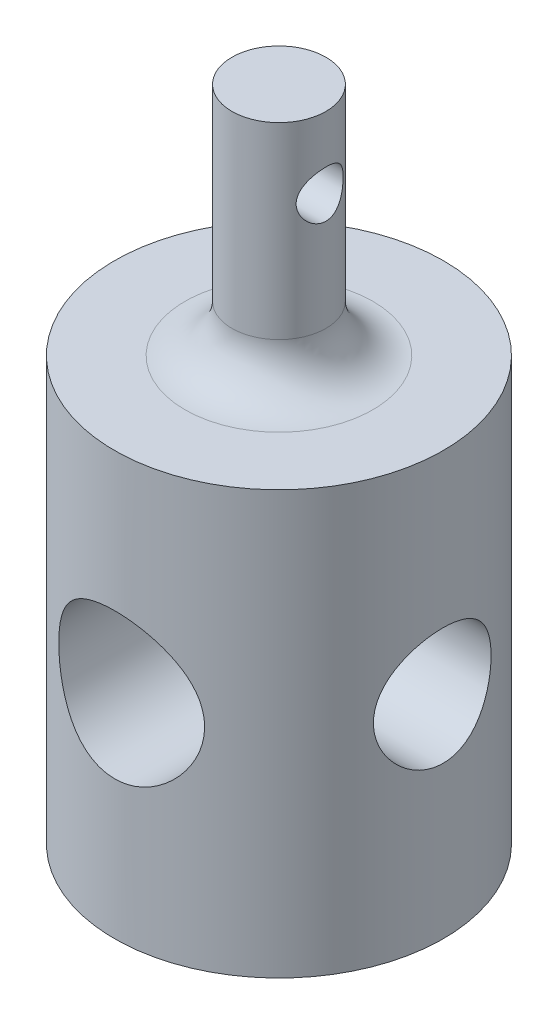
ISO-10303-21;
HEADER;
FILE_DESCRIPTION(('STEP AP214'),'2;1');
FILE_NAME('part.step','',(''),(''),'','','');
FILE_SCHEMA(('AUTOMOTIVE_DESIGN { 1 0 10303 214 1 1 1 1 }'));
ENDSEC;
DATA;
#1=APPLICATION_CONTEXT('core data for automotive mechanical design processes');
#2=APPLICATION_PROTOCOL_DEFINITION('international standard','automotive_design',2000,#1);
#3=PRODUCT_CONTEXT('',#1,'mechanical');
#4=PRODUCT('Part','Part','',(#3));
#5=PRODUCT_RELATED_PRODUCT_CATEGORY('part','',(#4));
#6=PRODUCT_DEFINITION_FORMATION('','',#4);
#7=PRODUCT_DEFINITION_CONTEXT('part definition',#1,'design');
#8=PRODUCT_DEFINITION('design','',#6,#7);
#9=PRODUCT_DEFINITION_SHAPE('','',#8);
#10=(LENGTH_UNIT() NAMED_UNIT(*) SI_UNIT(.MILLI.,.METRE.));
#11=(NAMED_UNIT(*) PLANE_ANGLE_UNIT() SI_UNIT($,.RADIAN.));
#12=(NAMED_UNIT(*) SI_UNIT($,.STERADIAN.) SOLID_ANGLE_UNIT());
#13=UNCERTAINTY_MEASURE_WITH_UNIT(LENGTH_MEASURE(1.E-05),#10,'distance_accuracy_value','');
#14=(GEOMETRIC_REPRESENTATION_CONTEXT(3) GLOBAL_UNCERTAINTY_ASSIGNED_CONTEXT((#13)) GLOBAL_UNIT_ASSIGNED_CONTEXT((#10,
#11,#12)) REPRESENTATION_CONTEXT('',''));
#15=CARTESIAN_POINT('',(0.,0.,0.));
#16=DIRECTION('',(0.,0.,1.));
#17=DIRECTION('',(1.,0.,0.));
#18=AXIS2_PLACEMENT_3D('',#15,#16,#17);
#19=CARTESIAN_POINT('',(0.,5.,0.));
#20=DIRECTION('',(0.,-1.,0.));
#21=DIRECTION('',(0.,0.,-1.));
#22=AXIS2_PLACEMENT_3D('',#19,#20,#21);
#23=CYLINDRICAL_SURFACE('',#22,1.);
#24=CARTESIAN_POINT('',(0.,1.,0.));
#25=DIRECTION('',(0.,-1.,0.));
#26=DIRECTION('',(0.,0.,-1.));
#27=AXIS2_PLACEMENT_3D('',#24,#25,#26);
#28=CIRCLE('',#27,1.);
#29=CARTESIAN_POINT('',(0.,1.,-1.));
#30=VERTEX_POINT('',#29);
#31=EDGE_CURVE('E45',#30,#30,#28,.F.);
#32=ORIENTED_EDGE('',*,*,#31,.T.);
#33=EDGE_LOOP('',(#32));
#34=FACE_BOUND('',#33,.T.);
#35=CARTESIAN_POINT('',(-0.866025403784444,3.47609895451623,-0.49999999999999));
#36=CARTESIAN_POINT('',(-0.866027673641391,3.50215285861371,-0.499998181537053));
#37=CARTESIAN_POINT('',(-0.867219005938544,3.52823966027871,-0.497949985366544));
#38=CARTESIAN_POINT('',(-0.871811832260512,3.57961258685484,-0.489861604949071));
#39=CARTESIAN_POINT('',(-0.875217970277868,3.60489691203794,-0.483813032277095));
#40=CARTESIAN_POINT('',(-0.883746733026932,3.65382478668819,-0.468049974349882));
#41=CARTESIAN_POINT('',(-0.888860217366247,3.67747628075302,-0.458354976246852));
#42=CARTESIAN_POINT('',(-0.900213324084311,3.72281105551459,-0.435633762688181));
#43=CARTESIAN_POINT('',(-0.906453007380332,3.74449422964745,-0.422607367017879));
#44=CARTESIAN_POINT('',(-0.919984345287206,3.78725181879498,-0.392333270265429));
#45=CARTESIAN_POINT('',(-0.92732031818977,3.808128522353,-0.374826018071876));
#46=CARTESIAN_POINT('',(-0.941859913928533,3.84680314871958,-0.336626903807226));
#47=CARTESIAN_POINT('',(-0.949063469156253,3.86459953580798,-0.315933462891138));
#48=CARTESIAN_POINT('',(-0.963107384764747,3.89778253009005,-0.270244781707265));
#49=CARTESIAN_POINT('',(-0.969890532090864,3.91292583844599,-0.24505359450628));
#50=CARTESIAN_POINT('',(-0.981753780497646,3.9386693811391,-0.192078513299745));
#51=CARTESIAN_POINT('',(-0.986834955918709,3.94927248258481,-0.164296269069071));
#52=CARTESIAN_POINT('',(-0.994402306221188,3.96485128516677,-0.109022471962983));
#53=CARTESIAN_POINT('',(-0.99704740110446,3.97017371769399,-0.0816508952444035));
#54=CARTESIAN_POINT('',(-1.00003791923034,3.97618201385374,-0.0262853143489194));
#55=CARTESIAN_POINT('',(-1.00038473392295,3.97687068291408,0.00170830292187356));
#56=CARTESIAN_POINT('',(-0.99881490958225,3.97372561753105,0.0549162622118787));
#57=CARTESIAN_POINT('',(-0.997092479460802,3.97027994675561,0.0801605995883992));
#58=CARTESIAN_POINT('',(-0.991871226298737,3.95965853256389,0.129656885959164));
#59=CARTESIAN_POINT('',(-0.988372270331968,3.95248251002811,0.153908760546965));
#60=CARTESIAN_POINT('',(-0.979857916438272,3.93455767147131,0.201154695784779));
#61=CARTESIAN_POINT('',(-0.974822207645995,3.92376079793019,0.224126711757591));
#62=CARTESIAN_POINT('',(-0.963688229933436,3.89896724641547,0.267988400756665));
#63=CARTESIAN_POINT('',(-0.95758958078742,3.88496942286505,0.288877324419324));
#64=CARTESIAN_POINT('',(-0.944221971996145,3.85265127874971,0.330086830449098));
#65=CARTESIAN_POINT('',(-0.936896879990875,3.83404744035322,0.35016703751468));
#66=CARTESIAN_POINT('',(-0.922271702934058,3.79380409205113,0.38705218514889));
#67=CARTESIAN_POINT('',(-0.914971641328144,3.77216226837919,0.403854605787114));
#68=CARTESIAN_POINT('',(-0.900720780462424,3.72477485830418,0.434752667321104));
#69=CARTESIAN_POINT('',(-0.893821599953538,3.69885594298912,0.448608657489024));
#70=CARTESIAN_POINT('',(-0.88187725139288,3.64463011883672,0.471659556500614));
#71=CARTESIAN_POINT('',(-0.876830150230339,3.61632573800744,0.480859329105442));
#72=CARTESIAN_POINT('',(-0.869723179085174,3.56049169887483,0.493590105512517));
#73=CARTESIAN_POINT('',(-0.867458279242484,3.53307839499445,0.497512561059985));
#74=CARTESIAN_POINT('',(-0.865589596808049,3.47789828375796,0.50075847330571));
#75=CARTESIAN_POINT('',(-0.86598393444656,3.45013173995633,0.500085178657509));
#76=CARTESIAN_POINT('',(-0.869171682702926,3.39827199522686,0.49451802167198));
#77=CARTESIAN_POINT('',(-0.871697937533273,3.37410922896226,0.49009390835623));
#78=CARTESIAN_POINT('',(-0.878470107756707,3.32691506138075,0.477848142316217));
#79=CARTESIAN_POINT('',(-0.882716580025171,3.30388402914292,0.470025389311804));
#80=CARTESIAN_POINT('',(-0.892681110398285,3.25839328906488,0.45082379430244));
#81=CARTESIAN_POINT('',(-0.898458216215318,3.23600944608945,0.439297031846358));
#82=CARTESIAN_POINT('',(-0.91078059748625,3.19336431874673,0.413143532007899));
#83=CARTESIAN_POINT('',(-0.917326266775739,3.17310413275959,0.398515202166105));
#84=CARTESIAN_POINT('',(-0.931439992281682,3.13260957075446,0.364418583599423));
#85=CARTESIAN_POINT('',(-0.939032915771448,3.1127003791574,0.34457263615748));
#86=CARTESIAN_POINT('',(-0.953671174889461,3.07639283551944,0.301702247699142));
#87=CARTESIAN_POINT('',(-0.96071632503854,3.05999566940096,0.278676737327673));
#88=CARTESIAN_POINT('',(-0.973706808454792,3.03081209154118,0.229267681279375));
#89=CARTESIAN_POINT('',(-0.979618208360173,3.01813239541078,0.202811548787049));
#90=CARTESIAN_POINT('',(-0.989416774796479,2.99753000258753,0.147761182320546));
#91=CARTESIAN_POINT('',(-0.993305718381767,2.98960312883307,0.11916885069611));
#92=CARTESIAN_POINT('',(-0.998337540909503,2.97941467242892,0.0634898411651889));
#93=CARTESIAN_POINT('',(-0.999699639541274,2.97670001657823,0.0365057219251578));
#94=CARTESIAN_POINT('',(-1.00021065187534,2.97567732178898,-0.017562992975529));
#95=CARTESIAN_POINT('',(-0.999360340333266,2.97736774025427,-0.0446475501472761));
#96=CARTESIAN_POINT('',(-0.995669844190719,2.98480715791422,-0.0962689961588191));
#97=CARTESIAN_POINT('',(-0.992964473343949,2.99028137914569,-0.120856158906526));
#98=CARTESIAN_POINT('',(-0.985960468313117,3.0047624541671,-0.168722976090909));
#99=CARTESIAN_POINT('',(-0.981661605649086,3.01376981456064,-0.19200244247441));
#100=CARTESIAN_POINT('',(-0.971629653756131,3.03546248060164,-0.237711703125921));
#101=CARTESIAN_POINT('',(-0.965843086053096,3.04828861612937,-0.260062571363275));
#102=CARTESIAN_POINT('',(-0.953440665650005,3.07707791993654,-0.302387320893745));
#103=CARTESIAN_POINT('',(-0.946824432570786,3.09304252903962,-0.322360103657873));
#104=CARTESIAN_POINT('',(-0.932643051375995,3.12949752406587,-0.361457002133388));
#105=CARTESIAN_POINT('',(-0.925048996007111,3.15028019840363,-0.380298842483288));
#106=CARTESIAN_POINT('',(-0.910315381771857,3.1948243152318,-0.41433164391288));
#107=CARTESIAN_POINT('',(-0.903176229068857,3.21858836499169,-0.42951937506378));
#108=CARTESIAN_POINT('',(-0.889998026256441,3.26941727776538,-0.456215539833043));
#109=CARTESIAN_POINT('',(-0.884000871211849,3.29656272006989,-0.467592532964967));
#110=CARTESIAN_POINT('',(-0.874330781711035,3.3527651566968,-0.48543935476864));
#111=CARTESIAN_POINT('',(-0.870650080748798,3.38181539897416,-0.491925595589957));
#112=CARTESIAN_POINT('',(-0.867646363005213,3.42200163234165,-0.497183503931363));
#113=CARTESIAN_POINT('',(-0.867040645024733,3.43278290171501,-0.498238052481686));
#114=CARTESIAN_POINT('',(-0.866229679439787,3.45440719485751,-0.499646702545202));
#115=CARTESIAN_POINT('',(-0.866024458625931,3.46525022270922,-0.50000075720001));
#116=CARTESIAN_POINT('',(-0.866025403784444,3.47609895451623,-0.49999999999999));
#117=B_SPLINE_CURVE_WITH_KNOTS('',3,(#35,#36,#37,#38,#39,#40,#41,#42,#43,#44,#45,#46,#47,#48,
#49,#50,#51,#52,#53,#54,#55,#56,#57,#58,#59,#60,#61,#62,#63,#64,#65,#66,#67,#68,#69,#70,#71,#72,
#73,#74,#75,#76,#77,#78,#79,#80,#81,#82,#83,#84,#85,#86,#87,#88,#89,#90,#91,#92,#93,#94,#95,#96,
#97,#98,#99,#100,#101,#102,#103,#104,#105,#106,#107,#108,#109,#110,#111,#112,#113,#114,#115,
#116),.UNSPECIFIED.,.T.,.F.,(4,2,2,2,2,2,2,2,2,2,2,2,2,2,2,2,2,2,2,2,2,2,2,2,2,2,2,2,2,2,2,2,2,
2,2,2,2,2,2,2,4),(0.,0.0781160612973575,0.156396446412401,0.23426429795944,0.312136362722571,
0.396431156249112,0.480767855421849,0.57078946119381,0.660754134819447,0.744317424839666,
0.82783011843019,0.904080487422681,0.980336562587264,1.05764767365572,1.13498649675135,
1.21963595728444,1.30435024122958,1.39444420864723,1.48444387105851,1.56731145427104,
1.65012046594184,1.72387091712011,1.79764526218029,1.87483648203041,1.95206743110021,
2.03903371790304,2.12602932489098,2.2153209070648,2.30453389904383,2.3855613519474,
2.46656043396983,2.54222212435743,2.61789466756003,2.69680375359733,2.77574915050356,
2.86255120925216,2.94942971422222,3.03905374518947,3.12837566501025,3.16090067592299,
3.19342786246914),.UNSPECIFIED.);
#118=CARTESIAN_POINT('',(-0.866025403784444,3.47609895451623,-0.49999999999999));
#119=VERTEX_POINT('',#118);
#120=EDGE_CURVE('E58',#119,#119,#117,.T.);
#121=ORIENTED_EDGE('',*,*,#120,.T.);
#122=EDGE_LOOP('',(#121));
#123=FACE_BOUND('',#122,.T.);
#124=CARTESIAN_POINT('',(0.86602540378444,3.47609895451623,-0.499999999999997));
#125=CARTESIAN_POINT('',(0.866027673641388,3.45004505041874,-0.49999818153706));
#126=CARTESIAN_POINT('',(0.86721900593854,3.42395824875374,-0.497949985366551));
#127=CARTESIAN_POINT('',(0.871811832260509,3.37258532217761,-0.489861604949078));
#128=CARTESIAN_POINT('',(0.875217970277864,3.34730099699451,-0.483813032277101));
#129=CARTESIAN_POINT('',(0.883746733026929,3.29837312234427,-0.468049974349889));
#130=CARTESIAN_POINT('',(0.888860217366244,3.27472162827944,-0.458354976246859));
#131=CARTESIAN_POINT('',(0.900213324084308,3.22938685351787,-0.435633762688187));
#132=CARTESIAN_POINT('',(0.906453007380329,3.207703679385,-0.422607367017885));
#133=CARTESIAN_POINT('',(0.919984345287203,3.16494609023748,-0.392333270265436));
#134=CARTESIAN_POINT('',(0.927320318189767,3.14406938667946,-0.374826018071883));
#135=CARTESIAN_POINT('',(0.94185991392853,3.10539476031288,-0.336626903807233));
#136=CARTESIAN_POINT('',(0.94906346915625,3.08759837322447,-0.315933462891145));
#137=CARTESIAN_POINT('',(0.963107384764745,3.0544153789424,-0.270244781707272));
#138=CARTESIAN_POINT('',(0.969890532090862,3.03927207058647,-0.245053594506287));
#139=CARTESIAN_POINT('',(0.981753780497645,3.01352852789335,-0.192078513299753));
#140=CARTESIAN_POINT('',(0.986834955918708,3.00292542644765,-0.164296269069079));
#141=CARTESIAN_POINT('',(0.994402306221187,2.98734662386569,-0.10902247196299));
#142=CARTESIAN_POINT('',(0.99704740110446,2.98202419133847,-0.0816508952444106));
#143=CARTESIAN_POINT('',(1.00003791923034,2.97601589517872,-0.0262853143489267));
#144=CARTESIAN_POINT('',(1.00038473392295,2.97532722611838,0.00170830292186625));
#145=CARTESIAN_POINT('',(0.998814909582251,2.97847229150141,0.0549162622118713));
#146=CARTESIAN_POINT('',(0.997092479460802,2.98191796227685,0.0801605995883918));
#147=CARTESIAN_POINT('',(0.991871226298738,2.99253937646856,0.129656885959156));
#148=CARTESIAN_POINT('',(0.98837227033197,2.99971539900435,0.153908760546958));
#149=CARTESIAN_POINT('',(0.979857916438273,3.01764023756114,0.201154695784772));
#150=CARTESIAN_POINT('',(0.974822207645997,3.02843711110227,0.224126711757584));
#151=CARTESIAN_POINT('',(0.963688229933437,3.05323066261698,0.267988400756658));
#152=CARTESIAN_POINT('',(0.957589580787422,3.06722848616741,0.288877324419317));
#153=CARTESIAN_POINT('',(0.944221971996148,3.09954663028274,0.330086830449091));
#154=CARTESIAN_POINT('',(0.936896879990878,3.11815046867924,0.350167037514674));
#155=CARTESIAN_POINT('',(0.922271702934061,3.15839381698132,0.387052185148883));
#156=CARTESIAN_POINT('',(0.914971641328147,3.18003564065326,0.403854605787108));
#157=CARTESIAN_POINT('',(0.900720780462427,3.22742305072828,0.434752667321098));
#158=CARTESIAN_POINT('',(0.893821599953542,3.25334196604334,0.448608657489017));
#159=CARTESIAN_POINT('',(0.881877251392884,3.30756779019573,0.471659556500607));
#160=CARTESIAN_POINT('',(0.876830150230342,3.33587217102501,0.480859329105436));
#161=CARTESIAN_POINT('',(0.869723179085177,3.39170621015763,0.493590105512511));
#162=CARTESIAN_POINT('',(0.867458279242487,3.41911951403801,0.497512561059978));
#163=CARTESIAN_POINT('',(0.865589596808053,3.4742996252745,0.500758473305704));
#164=CARTESIAN_POINT('',(0.865983934446564,3.50206616907612,0.500085178657503));
#165=CARTESIAN_POINT('',(0.86917168270293,3.55392591380559,0.494518021671973));
#166=CARTESIAN_POINT('',(0.871697937533276,3.57808868007019,0.490093908356224));
#167=CARTESIAN_POINT('',(0.878470107756711,3.62528284765171,0.477848142316211));
#168=CARTESIAN_POINT('',(0.882716580025175,3.64831387988953,0.470025389311797));
#169=CARTESIAN_POINT('',(0.892681110398288,3.69380461996757,0.450823794302433));
#170=CARTESIAN_POINT('',(0.898458216215321,3.716188462943,0.439297031846352));
#171=CARTESIAN_POINT('',(0.910780597486253,3.75883359028572,0.413143532007892));
#172=CARTESIAN_POINT('',(0.917326266775742,3.77909377627287,0.398515202166098));
#173=CARTESIAN_POINT('',(0.931439992281684,3.819588338278,0.364418583599417));
#174=CARTESIAN_POINT('',(0.939032915771451,3.83949752987505,0.344572636157473));
#175=CARTESIAN_POINT('',(0.953671174889464,3.87580507351302,0.301702247699135));
#176=CARTESIAN_POINT('',(0.960716325038542,3.8922022396315,0.278676737327666));
#177=CARTESIAN_POINT('',(0.973706808454793,3.92138581749127,0.229267681279368));
#178=CARTESIAN_POINT('',(0.979618208360174,3.93406551362167,0.202811548787042));
#179=CARTESIAN_POINT('',(0.98941677479648,3.95466790644492,0.147761182320539));
#180=CARTESIAN_POINT('',(0.993305718381768,3.96259478019939,0.119168850696102));
#181=CARTESIAN_POINT('',(0.998337540909503,3.97278323660354,0.0634898411651816));
#182=CARTESIAN_POINT('',(0.999699639541274,3.97549789245423,0.0365057219251505));
#183=CARTESIAN_POINT('',(1.00021065187534,3.97652058724347,-0.0175629929755363));
#184=CARTESIAN_POINT('',(0.999360340333266,3.97483016877819,-0.0446475501472834));
#185=CARTESIAN_POINT('',(0.995669844190718,3.96739075111824,-0.0962689961588263));
#186=CARTESIAN_POINT('',(0.992964473343948,3.96191652988676,-0.120856158906533));
#187=CARTESIAN_POINT('',(0.985960468313116,3.94743545486536,-0.168722976090916));
#188=CARTESIAN_POINT('',(0.981661605649084,3.93842809447182,-0.192002442474417));
#189=CARTESIAN_POINT('',(0.97162965375613,3.91673542843081,-0.237711703125929));
#190=CARTESIAN_POINT('',(0.965843086053094,3.90390929290309,-0.260062571363282));
#191=CARTESIAN_POINT('',(0.953440665650002,3.87511998909591,-0.302387320893752));
#192=CARTESIAN_POINT('',(0.946824432570784,3.85915537999283,-0.32236010365788));
#193=CARTESIAN_POINT('',(0.932643051375992,3.82270038496658,-0.361457002133394));
#194=CARTESIAN_POINT('',(0.925048996007108,3.80191771062883,-0.380298842483295));
#195=CARTESIAN_POINT('',(0.910315381771854,3.75737359380066,-0.414331643912887));
#196=CARTESIAN_POINT('',(0.903176229068855,3.73360954404077,-0.429519375063787));
#197=CARTESIAN_POINT('',(0.889998026256438,3.68278063126708,-0.45621553983305));
#198=CARTESIAN_POINT('',(0.884000871211845,3.65563518896257,-0.467592532964973));
#199=CARTESIAN_POINT('',(0.874330781711031,3.59943275233566,-0.485439354768646));
#200=CARTESIAN_POINT('',(0.870650080748794,3.5703825100583,-0.491925595589963));
#201=CARTESIAN_POINT('',(0.86764636300521,3.5301962766908,-0.49718350393137));
#202=CARTESIAN_POINT('',(0.86704064502473,3.51941500731744,-0.498238052481692));
#203=CARTESIAN_POINT('',(0.866229679439783,3.49779071417495,-0.499646702545208));
#204=CARTESIAN_POINT('',(0.866024458625927,3.48694768632323,-0.500000757200017));
#205=CARTESIAN_POINT('',(0.86602540378444,3.47609895451623,-0.499999999999997));
#206=B_SPLINE_CURVE_WITH_KNOTS('',3,(#124,#125,#126,#127,#128,#129,#130,#131,#132,#133,#134,
#135,#136,#137,#138,#139,#140,#141,#142,#143,#144,#145,#146,#147,#148,#149,#150,#151,#152,#153,
#154,#155,#156,#157,#158,#159,#160,#161,#162,#163,#164,#165,#166,#167,#168,#169,#170,#171,#172,
#173,#174,#175,#176,#177,#178,#179,#180,#181,#182,#183,#184,#185,#186,#187,#188,#189,#190,#191,
#192,#193,#194,#195,#196,#197,#198,#199,#200,#201,#202,#203,#204,#205),.UNSPECIFIED.,.T.,.F.,(4,
2,2,2,2,2,2,2,2,2,2,2,2,2,2,2,2,2,2,2,2,2,2,2,2,2,2,2,2,2,2,2,2,2,2,2,2,2,2,2,4),(0.,
0.0781160612973575,0.156396446412401,0.23426429795944,0.312136362722571,0.396431156249112,
0.480767855421849,0.57078946119381,0.660754134819447,0.744317424839666,0.827830118430189,
0.90408048742268,0.980336562587264,1.05764767365572,1.13498649675134,1.21963595728444,
1.30435024122958,1.39444420864722,1.48444387105851,1.56731145427104,1.65012046594184,
1.72387091712011,1.79764526218029,1.87483648203042,1.95206743110021,2.03903371790304,
2.12602932489099,2.2153209070648,2.30453389904383,2.3855613519474,2.46656043396983,
2.54222212435743,2.61789466756003,2.69680375359733,2.77574915050356,2.86255120925216,
2.94942971422222,3.03905374518947,3.12837566501025,3.16090067592299,3.19342786246914),.UNSPECIFIED.);
#207=CARTESIAN_POINT('',(0.86602540378444,3.47609895451623,-0.499999999999997));
#208=VERTEX_POINT('',#207);
#209=EDGE_CURVE('E50',#208,#208,#206,.T.);
#210=ORIENTED_EDGE('',*,*,#209,.T.);
#211=EDGE_LOOP('',(#210));
#212=FACE_BOUND('',#211,.T.);
#213=CARTESIAN_POINT('',(0.,5.,0.));
#214=DIRECTION('',(0.,1.,0.));
#215=DIRECTION('',(0.,0.,1.));
#216=AXIS2_PLACEMENT_3D('',#213,#214,#215);
#217=CIRCLE('',#216,1.);
#218=CARTESIAN_POINT('',(0.,5.,1.));
#219=VERTEX_POINT('',#218);
#220=EDGE_CURVE('E123',#219,#219,#217,.T.);
#221=ORIENTED_EDGE('',*,*,#220,.F.);
#222=EDGE_LOOP('',(#221));
#223=FACE_BOUND('',#222,.T.);
#224=ADVANCED_FACE('F37',(#34,#123,#212,#223),#23,.T.);
#225=CARTESIAN_POINT('',(0.,5.,0.));
#226=DIRECTION('',(0.,1.,0.));
#227=DIRECTION('',(0.,0.,1.));
#228=AXIS2_PLACEMENT_3D('',#225,#226,#227);
#229=PLANE('',#228);
#230=ORIENTED_EDGE('',*,*,#220,.T.);
#231=EDGE_LOOP('',(#230));
#232=FACE_BOUND('',#231,.T.);
#233=ADVANCED_FACE('F108',(#232),#229,.T.);
#234=CARTESIAN_POINT('',(0.,-9.,0.));
#235=DIRECTION('',(0.,1.,0.));
#236=DIRECTION('',(0.,0.,1.));
#237=AXIS2_PLACEMENT_3D('',#234,#235,#236);
#238=CYLINDRICAL_SURFACE('',#237,3.5);
#239=CARTESIAN_POINT('',(3.27167933668353,-4.51399038479046,-1.24342845307562));
#240=CARTESIAN_POINT('',(3.27167805635776,-4.58175391597345,-1.24342992136804));
#241=CARTESIAN_POINT('',(3.27379808585316,-4.64950731656918,-1.23789543175758));
#242=CARTESIAN_POINT('',(3.28199559910932,-4.78298684425495,-1.21599315262758));
#243=CARTESIAN_POINT('',(3.28807327833017,-4.84871287104929,-1.19962482804683));
#244=CARTESIAN_POINT('',(3.30340887186436,-4.97617776432842,-1.15672045441689));
#245=CARTESIAN_POINT('',(3.31265978732824,-5.0379250532165,-1.13020676710685));
#246=CARTESIAN_POINT('',(3.33328432610281,-5.1561208191852,-1.06784392392033));
#247=CARTESIAN_POINT('',(3.34465851814453,-5.21256787046589,-1.0319922657989));
#248=CARTESIAN_POINT('',(3.36881586833562,-5.32110098424677,-0.950244914633553));
#249=CARTESIAN_POINT('',(3.38163762320676,-5.37291431582241,-0.903998440077397));
#250=CARTESIAN_POINT('',(3.40690936537999,-5.46824380913099,-0.80352309204532));
#251=CARTESIAN_POINT('',(3.4193592821233,-5.51175840445436,-0.749292715001792));
#252=CARTESIAN_POINT('',(3.44293308014699,-5.59053492821683,-0.632353543860811));
#253=CARTESIAN_POINT('',(3.45400502378463,-5.62550513100558,-0.569436824109678));
#254=CARTESIAN_POINT('',(3.47309895581636,-5.6842579125174,-0.438149629897772));
#255=CARTESIAN_POINT('',(3.48112189653086,-5.70804398502436,-0.369780866404187));
#256=CARTESIAN_POINT('',(3.49292933255751,-5.7428108591905,-0.232396199313026));
#257=CARTESIAN_POINT('',(3.49686866535365,-5.75426016490821,-0.163512423898868));
#258=CARTESIAN_POINT('',(3.50060068203823,-5.7655245797043,-0.0246968626264262));
#259=CARTESIAN_POINT('',(3.50039458982285,-5.76534312261706,0.0452346078173645));
#260=CARTESIAN_POINT('',(3.49595502231735,-5.75363478600815,0.180821264737253));
#261=CARTESIAN_POINT('',(3.49190295219391,-5.74261813159938,0.246527394386379));
#262=CARTESIAN_POINT('',(3.4804426036615,-5.71040395921888,0.375081365623675));
#263=CARTESIAN_POINT('',(3.47303409090641,-5.68920573036559,0.437929007295614));
#264=CARTESIAN_POINT('',(3.45546421016199,-5.63696692687755,0.560024965382194));
#265=CARTESIAN_POINT('',(3.44526569565819,-5.60579250129285,0.619210449668447));
#266=CARTESIAN_POINT('',(3.42315354009466,-5.5346008147415,0.731647501871417));
#267=CARTESIAN_POINT('',(3.41123937677952,-5.49458085914266,0.784897254121683));
#268=CARTESIAN_POINT('',(3.38617633740579,-5.40432499682314,0.886972156302092));
#269=CARTESIAN_POINT('',(3.37299550655103,-5.35365693381823,0.935407919917129));
#270=CARTESIAN_POINT('',(3.34740050092063,-5.24481864108106,1.02323383012572));
#271=CARTESIAN_POINT('',(3.33498648390975,-5.18664687508477,1.06262211978797));
#272=CARTESIAN_POINT('',(3.31212791359918,-5.06305155881258,1.13188712462275));
#273=CARTESIAN_POINT('',(3.30172400041588,-4.99751385150854,1.16157459220721));
#274=CARTESIAN_POINT('',(3.28452526569317,-4.86190065874308,1.20935784394325));
#275=CARTESIAN_POINT('',(3.27772865887546,-4.79182743723757,1.22745936296784));
#276=CARTESIAN_POINT('',(3.2689234622006,-4.65294844192253,1.25071462484654));
#277=CARTESIAN_POINT('',(3.26668892677513,-4.58425947845585,1.2564800895801));
#278=CARTESIAN_POINT('',(3.26662359490862,-4.44687369717772,1.25665092440743));
#279=CARTESIAN_POINT('',(3.26879183861374,-4.37817688434242,1.25105877058584));
#280=CARTESIAN_POINT('',(3.2770611556473,-4.24570349742791,1.22922535061094));
#281=CARTESIAN_POINT('',(3.28299545935907,-4.1818410130023,1.21343517524039));
#282=CARTESIAN_POINT('',(3.29793933599299,-4.05769542729336,1.17220880979172));
#283=CARTESIAN_POINT('',(3.30694950271641,-3.99741301979078,1.14677075706696));
#284=CARTESIAN_POINT('',(3.32742409659633,-3.87979029604651,1.08596027951506));
#285=CARTESIAN_POINT('',(3.33896354384516,-3.82262742189919,1.05027060476583));
#286=CARTESIAN_POINT('',(3.36306854222647,-3.71488652438893,0.970314933018716));
#287=CARTESIAN_POINT('',(3.37563443685938,-3.66431072019919,0.926046058134767));
#288=CARTESIAN_POINT('',(3.40124249419375,-3.56821903979236,0.827221286698767));
#289=CARTESIAN_POINT('',(3.41427143575098,-3.52315069205911,0.77222539662129));
#290=CARTESIAN_POINT('',(3.43865918275393,-3.44284404226512,0.65512947805479));
#291=CARTESIAN_POINT('',(3.45001801611398,-3.40760557589801,0.593029568333851));
#292=CARTESIAN_POINT('',(3.46976524848253,-3.34824027308639,0.4636632606691));
#293=CARTESIAN_POINT('',(3.47816858298412,-3.32405737606014,0.39642499314428));
#294=CARTESIAN_POINT('',(3.49112936463433,-3.28746695526189,0.258468987612018));
#295=CARTESIAN_POINT('',(3.49568843124014,-3.27505447274623,0.187752728062926));
#296=CARTESIAN_POINT('',(3.50031069229685,-3.26285390146831,0.0489123185432997));
#297=CARTESIAN_POINT('',(3.5006008712936,-3.26242733156601,-0.019148715399382));
#298=CARTESIAN_POINT('',(3.49724900670124,-3.27259807328384,-0.154336400365808));
#299=CARTESIAN_POINT('',(3.49360736543706,-3.28319425699271,-0.221463146279062));
#300=CARTESIAN_POINT('',(3.48290487055558,-3.31467044943826,-0.351492880572067));
#301=CARTESIAN_POINT('',(3.47591545482648,-3.33533574647471,-0.414454168927294));
#302=CARTESIAN_POINT('',(3.45925352342268,-3.38615693015593,-0.536035833712441));
#303=CARTESIAN_POINT('',(3.44958050502906,-3.41631459514727,-0.594655394197733));
#304=CARTESIAN_POINT('',(3.42805792916685,-3.48664606095238,-0.708454317599133));
#305=CARTESIAN_POINT('',(3.4161367191955,-3.52717262233969,-0.763401888270762));
#306=CARTESIAN_POINT('',(3.39160204418227,-3.61651661438632,-0.865920956680693));
#307=CARTESIAN_POINT('',(3.37898834355175,-3.66533687858214,-0.913489922863594));
#308=CARTESIAN_POINT('',(3.35378494155349,-3.77259979837753,-1.00217408873609));
#309=CARTESIAN_POINT('',(3.34122386422083,-3.83138532349993,-1.04288420764212));
#310=CARTESIAN_POINT('',(3.31824658541415,-3.95535959194585,-1.11383861407112));
#311=CARTESIAN_POINT('',(3.30783023926201,-4.02054790291518,-1.14408360763867));
#312=CARTESIAN_POINT('',(3.29045021908204,-4.15586084670909,-1.19315729973068));
#313=CARTESIAN_POINT('',(3.28350100909447,-4.22600478797666,-1.21193824460762));
#314=CARTESIAN_POINT('',(3.27411738674644,-4.36876733155927,-1.23706991538801));
#315=CARTESIAN_POINT('',(3.27168070849757,-4.44138467323406,-1.24342687986339));
#316=CARTESIAN_POINT('',(3.27167933668353,-4.51399038479046,-1.24342845307562));
#317=B_SPLINE_CURVE_WITH_KNOTS('',3,(#239,#240,#241,#242,#243,#244,#245,#246,#247,#248,#249,
#250,#251,#252,#253,#254,#255,#256,#257,#258,#259,#260,#261,#262,#263,#264,#265,#266,#267,#268,
#269,#270,#271,#272,#273,#274,#275,#276,#277,#278,#279,#280,#281,#282,#283,#284,#285,#286,#287,
#288,#289,#290,#291,#292,#293,#294,#295,#296,#297,#298,#299,#300,#301,#302,#303,#304,#305,#306,
#307,#308,#309,#310,#311,#312,#313,#314,#315,#316),.UNSPECIFIED.,.T.,.F.,(4,2,2,2,2,2,2,2,2,2,2,
2,2,2,2,2,2,2,2,2,2,2,2,2,2,2,2,2,2,2,2,2,2,2,2,2,2,2,4),(0.,0.203020883138163,
0.406051793815669,0.608637751162812,0.81127805031059,1.02220501259776,1.233171748617,
1.45056406841854,1.66788843235754,1.87663230111989,2.08531454120125,2.2846186866864,
2.48393674968959,2.68604985529559,2.88822461610463,3.10122083881641,3.31426073854219,
3.5312380464741,3.74810787062259,3.95394726789475,4.15974179475172,4.35700470913188,
4.55430572705355,4.75852942964239,4.96282175786676,5.17866024153268,5.39449511724436,
5.60922305543409,5.82386049090844,6.02704135069302,6.23020142189362,6.42920732216892,
6.62825052739446,6.83526508050379,7.04235050272171,7.25910581081146,7.4758464923433,
7.69348395638326,7.91101210793798),.UNSPECIFIED.);
#318=CARTESIAN_POINT('',(3.27167933668353,-4.51399038479046,-1.24342845307562));
#319=VERTEX_POINT('',#318);
#320=EDGE_CURVE('E92',#319,#319,#317,.T.);
#321=ORIENTED_EDGE('',*,*,#320,.T.);
#322=EDGE_LOOP('',(#321));
#323=FACE_BOUND('',#322,.T.);
#324=CARTESIAN_POINT('',(0.,-6.05094275669455,3.5));
#325=CARTESIAN_POINT('',(-0.0826035368602606,-6.05070240508102,3.49999689515477));
#326=CARTESIAN_POINT('',(-0.165318272258858,-6.04382712779178,3.4970429820216));
#327=CARTESIAN_POINT('',(-0.328331295039293,-6.01707246732112,3.48552891146738));
#328=CARTESIAN_POINT('',(-0.408623224897883,-5.99716153795786,3.476955154005));
#329=CARTESIAN_POINT('',(-0.564175348568855,-5.94522696141991,3.45511978876348));
#330=CARTESIAN_POINT('',(-0.639452436795504,-5.91324668517592,3.44187497735023));
#331=CARTESIAN_POINT('',(-0.783497785630139,-5.83827036865671,3.41197158214522));
#332=CARTESIAN_POINT('',(-0.852267562056756,-5.79527690249629,3.39531379625044));
#333=CARTESIAN_POINT('',(-0.985281468357314,-5.69697898352809,3.35919768360224));
#334=CARTESIAN_POINT('',(-1.04911815656827,-5.64116003580589,3.33964007050224));
#335=CARTESIAN_POINT('',(-1.16687876088105,-5.51989859927652,3.30034168179323));
#336=CARTESIAN_POINT('',(-1.22079682518748,-5.45445047015571,3.28060080523033));
#337=CARTESIAN_POINT('',(-1.3202060667465,-5.31131598296761,3.24192273461006));
#338=CARTESIAN_POINT('',(-1.36504934582987,-5.23314720549478,3.2230938951908));
#339=CARTESIAN_POINT('',(-1.44075909879648,-5.06942238691428,3.18997393204705));
#340=CARTESIAN_POINT('',(-1.4716338820045,-4.98387077373813,3.17568011212851));
#341=CARTESIAN_POINT('',(-1.51679564585835,-4.81256018001953,3.15435069301276));
#342=CARTESIAN_POINT('',(-1.53188101386907,-4.72705667867988,3.14696798850632));
#343=CARTESIAN_POINT('',(-1.5475147226166,-4.55443804523233,3.13931246074746));
#344=CARTESIAN_POINT('',(-1.54807248950907,-4.46732399484715,3.13903502728019));
#345=CARTESIAN_POINT('',(-1.53524557386808,-4.30217142703116,3.1453227391334));
#346=CARTESIAN_POINT('',(-1.52308624404102,-4.22401011400712,3.15128654309171));
#347=CARTESIAN_POINT('',(-1.48722483377313,-4.07097591345325,3.16836750037969));
#348=CARTESIAN_POINT('',(-1.46352015519927,-3.99610377024555,3.17948581363861));
#349=CARTESIAN_POINT('',(-1.40473160125269,-3.84966760047894,3.20589844247824));
#350=CARTESIAN_POINT('',(-1.36939161487688,-3.77822385658148,3.22128539130202));
#351=CARTESIAN_POINT('',(-1.28852234206856,-3.64197248892459,3.25447660208178));
#352=CARTESIAN_POINT('',(-1.24298875007145,-3.57716768622305,3.27228188423736));
#353=CARTESIAN_POINT('',(-1.13787004198443,-3.44944394191182,3.3103875485614));
#354=CARTESIAN_POINT('',(-1.07735220622851,-3.38731256796798,3.33076276278028));
#355=CARTESIAN_POINT('',(-0.946567821703395,-3.27379890174094,3.3702631079505));
#356=CARTESIAN_POINT('',(-0.876298453831969,-3.22241972865794,3.38938787504542));
#357=CARTESIAN_POINT('',(-0.725441227858777,-3.13057663996832,3.42489374939607));
#358=CARTESIAN_POINT('',(-0.644619557458842,-3.09045860206732,3.44118304887056));
#359=CARTESIAN_POINT('',(-0.476466700265746,-3.02466925413685,3.46845989624233));
#360=CARTESIAN_POINT('',(-0.389139656754799,-2.99898883636265,3.47945078593256));
#361=CARTESIAN_POINT('',(-0.217032493389277,-2.96452231743486,3.49425655542373));
#362=CARTESIAN_POINT('',(-0.132502926614779,-2.95467816449734,3.49852044468524));
#363=CARTESIAN_POINT('',(0.0370996873874932,-2.94897446891523,3.50082939852536));
#364=CARTESIAN_POINT('',(0.122172546142501,-2.95311031431186,3.49887651401105));
#365=CARTESIAN_POINT('',(0.285338635395003,-2.97452348452075,3.4892531416522));
#366=CARTESIAN_POINT('',(0.363553579848341,-2.99103969835761,3.48191429526129));
#367=CARTESIAN_POINT('',(0.515991775660803,-3.03565836297382,3.46260872429306));
#368=CARTESIAN_POINT('',(0.590214529116987,-3.06376225518903,3.45064142397604));
#369=CARTESIAN_POINT('',(0.735259317833834,-3.13168621766075,3.42272200164748));
#370=CARTESIAN_POINT('',(0.805896005343029,-3.17185306026036,3.40665441440696));
#371=CARTESIAN_POINT('',(0.939681916069926,-3.26238047360881,3.37220667925195));
#372=CARTESIAN_POINT('',(1.0028278345231,-3.31274551725353,3.35382551795503));
#373=CARTESIAN_POINT('',(1.12516865958799,-3.42694096598914,3.31488166065715));
#374=CARTESIAN_POINT('',(1.18364223968206,-3.4915266909368,3.29426214147792));
#375=CARTESIAN_POINT('',(1.28915655290705,-3.62987151672788,3.2544221648431));
#376=CARTESIAN_POINT('',(1.33619344201032,-3.70363368934252,3.2352021793062));
#377=CARTESIAN_POINT('',(1.41836021840768,-3.86043844075281,3.20004726467941));
#378=CARTESIAN_POINT('',(1.45320800662127,-3.94364835265796,3.18419313492057));
#379=CARTESIAN_POINT('',(1.5080699975353,-4.11568823286869,3.15858484858588));
#380=CARTESIAN_POINT('',(1.52809865968396,-4.20451263083603,3.14882474734681));
#381=CARTESIAN_POINT('',(1.55126730059545,-4.37712955198571,3.13747041044018));
#382=CARTESIAN_POINT('',(1.555697802917,-4.4607082577627,3.13525274128896));
#383=CARTESIAN_POINT('',(1.55106125227966,-4.62738685836046,3.13754951706764));
#384=CARTESIAN_POINT('',(1.54199687082444,-4.71048684468147,3.14206262954415));
#385=CARTESIAN_POINT('',(1.51174658684482,-4.8688294333108,3.15671926361009));
#386=CARTESIAN_POINT('',(1.49129742599354,-4.94424777764958,3.16651954401598));
#387=CARTESIAN_POINT('',(1.43961815807542,-5.09057801054985,3.1903455511132));
#388=CARTESIAN_POINT('',(1.4083849252256,-5.16148858546199,3.2043725027627));
#389=CARTESIAN_POINT('',(1.3337018424009,-5.30182160685013,3.23619936234114));
#390=CARTESIAN_POINT('',(1.2895910868466,-5.37084931906378,3.2541849582219));
#391=CARTESIAN_POINT('',(1.19127873378345,-5.50091897922572,3.29144602216432));
#392=CARTESIAN_POINT('',(1.13707295193769,-5.56195759780609,3.31072202296232));
#393=CARTESIAN_POINT('',(1.0145893955437,-5.67973674327719,3.35038721570376));
#394=CARTESIAN_POINT('',(0.945502101934925,-5.73565546404179,3.37072946831482));
#395=CARTESIAN_POINT('',(0.798195945355952,-5.83517856130758,3.40861542016392));
#396=CARTESIAN_POINT('',(0.719973033628466,-5.87877744836547,3.42615787036215));
#397=CARTESIAN_POINT('',(0.55744712526961,-5.9516230094176,3.45629800438527));
#398=CARTESIAN_POINT('',(0.47323476716444,-5.98104624423563,3.46895610561717));
#399=CARTESIAN_POINT('',(0.300493216674034,-6.0250026981136,3.48815143210069));
#400=CARTESIAN_POINT('',(0.211978080506841,-6.03958138216383,3.49470734144602));
#401=CARTESIAN_POINT('',(0.102470895936322,-6.04798280820353,3.49856036216713));
#402=CARTESIAN_POINT('',(0.0820000742326971,-6.04914309829004,3.49909934174425));
#403=CARTESIAN_POINT('',(0.0410217879921713,-6.05065292127466,3.4998195477281));
#404=CARTESIAN_POINT('',(0.0205143231437072,-6.05100244724601,3.50000077107834));
#405=CARTESIAN_POINT('',(0.,-6.05094275669455,3.5));
#406=B_SPLINE_CURVE_WITH_KNOTS('',3,(#324,#325,#326,#327,#328,#329,#330,#331,#332,#333,#334,
#335,#336,#337,#338,#339,#340,#341,#342,#343,#344,#345,#346,#347,#348,#349,#350,#351,#352,#353,
#354,#355,#356,#357,#358,#359,#360,#361,#362,#363,#364,#365,#366,#367,#368,#369,#370,#371,#372,
#373,#374,#375,#376,#377,#378,#379,#380,#381,#382,#383,#384,#385,#386,#387,#388,#389,#390,#391,
#392,#393,#394,#395,#396,#397,#398,#399,#400,#401,#402,#403,#404,#405),.UNSPECIFIED.,.T.,.F.,(4,
2,2,2,2,2,2,2,2,2,2,2,2,2,2,2,2,2,2,2,2,2,2,2,2,2,2,2,2,2,2,2,2,2,2,2,2,2,2,2,4),(0.,
0.24772724244792,0.496056210032842,0.743501180960672,0.990888369219838,1.25084430460251,
1.51095312047274,1.78575197710346,2.06038715076026,2.32034357946587,2.58013133263939,
2.81700641267311,3.0539348230597,3.29647240094091,3.53911261552435,3.80520304907666,
4.0713705684548,4.34499018446657,4.61843699762492,4.87271613498097,5.12691139461381,
5.36664349407311,5.60640542373102,5.853855041803,6.10141342642993,6.36879605660801,
6.63626843387949,6.90957501693002,7.18261457392574,7.43245199395469,7.6822399616985,
7.91747954210133,8.15278736444604,8.40335518788306,8.6540271024968,8.9262691427971,
9.1986322974864,9.46750929149128,9.73556028560296,9.79708202521699,9.85860429044),.UNSPECIFIED.);
#407=CARTESIAN_POINT('',(0.,-6.05094275669455,3.5));
#408=VERTEX_POINT('',#407);
#409=EDGE_CURVE('E55',#408,#408,#406,.T.);
#410=ORIENTED_EDGE('',*,*,#409,.T.);
#411=EDGE_LOOP('',(#410));
#412=FACE_BOUND('',#411,.T.);
#413=CARTESIAN_POINT('',(1.54601905374422,-4.50094911219747,-3.14003584142917));
#414=CARTESIAN_POINT('',(1.54601511110104,-4.41883864533271,-3.14004013599466));
#415=CARTESIAN_POINT('',(1.53944867543249,-4.33659435129178,-3.1432970478481));
#416=CARTESIAN_POINT('',(1.51346964692397,-4.17452501383543,-3.1558846183347));
#417=CARTESIAN_POINT('',(1.49402434404424,-4.09470667320313,-3.16523074149794));
#418=CARTESIAN_POINT('',(1.44321847717103,-3.94012549968517,-3.18871328507664));
#419=CARTESIAN_POINT('',(1.4119107743877,-3.86534194710484,-3.20282842402208));
#420=CARTESIAN_POINT('',(1.33842897603755,-3.72210506378514,-3.2342230182721));
#421=CARTESIAN_POINT('',(1.29625647706108,-3.65365080495784,-3.25150200853841));
#422=CARTESIAN_POINT('',(1.19906709905764,-3.52015164506807,-3.28863331001072));
#423=CARTESIAN_POINT('',(1.14340092873753,-3.45560531442601,-3.30857953850405));
#424=CARTESIAN_POINT('',(1.02216692364414,-3.33638585081607,-3.34801988427891));
#425=CARTESIAN_POINT('',(0.956594992274397,-3.28171682331279,-3.36751381064206));
#426=CARTESIAN_POINT('',(0.813382644655603,-3.1811414593704,-3.4050183143272));
#427=CARTESIAN_POINT('',(0.735302056738501,-3.13581168204224,-3.42290556663657));
#428=CARTESIAN_POINT('',(0.571686576244558,-3.05914689113704,-3.45399640521965));
#429=CARTESIAN_POINT('',(0.486155426314171,-3.02780489896652,-3.4672023263607));
#430=CARTESIAN_POINT('',(0.315318613696513,-2.98186104378654,-3.48676529049962));
#431=CARTESIAN_POINT('',(0.230286506635508,-2.96639516669117,-3.4934745436395));
#432=CARTESIAN_POINT('',(0.0585876412360716,-2.94983478805221,-3.50056232631888));
#433=CARTESIAN_POINT('',(-0.0280783433413975,-2.94873364686141,-3.50094378070642));
#434=CARTESIAN_POINT('',(-0.194241012086983,-2.96051609413444,-3.49552726536143));
#435=CARTESIAN_POINT('',(-0.273821721424264,-2.97244568151894,-3.49015133396369));
#436=CARTESIAN_POINT('',(-0.429708416125314,-3.0082945037058,-3.4744050299746));
#437=CARTESIAN_POINT('',(-0.506014158543111,-3.03221462633555,-3.4640342875496));
#438=CARTESIAN_POINT('',(-0.65460044410951,-3.09162486529458,-3.43907915629459));
#439=CARTESIAN_POINT('',(-0.726801818561673,-3.12728592688898,-3.4244328975519));
#440=CARTESIAN_POINT('',(-0.86438159074671,-3.20898362237639,-3.392321122042));
#441=CARTESIAN_POINT('',(-0.929757491353454,-3.25502403426812,-3.37485457937303));
#442=CARTESIAN_POINT('',(-1.05726656729474,-3.36034201106595,-3.33720624118356));
#443=CARTESIAN_POINT('',(-1.11874731668524,-3.42037274945555,-3.31691892391783));
#444=CARTESIAN_POINT('',(-1.23107386833111,-3.54988107508334,-3.27689184150724));
#445=CARTESIAN_POINT('',(-1.28191444986677,-3.61936327232954,-3.25715234925982));
#446=CARTESIAN_POINT('',(-1.37351151925079,-3.7693730178306,-3.21963059965371));
#447=CARTESIAN_POINT('',(-1.41376736128512,-3.85023727555685,-3.20196220639007));
#448=CARTESIAN_POINT('',(-1.47982300329236,-4.01858409551888,-3.1719796504819));
#449=CARTESIAN_POINT('',(-1.50563467967693,-4.10606115313647,-3.15966109092095));
#450=CARTESIAN_POINT('',(-1.54029664225293,-4.27859619443776,-3.14290217936401));
#451=CARTESIAN_POINT('',(-1.55021310760364,-4.36339091274287,-3.13796824320324));
#452=CARTESIAN_POINT('',(-1.55596791691863,-4.53355862952827,-3.13512026555143));
#453=CARTESIAN_POINT('',(-1.551812289359,-4.61893136474693,-3.13720321802757));
#454=CARTESIAN_POINT('',(-1.53051633155775,-4.78093355630994,-3.14763991521945));
#455=CARTESIAN_POINT('',(-1.51439251044801,-4.85773261190199,-3.15550230608258));
#456=CARTESIAN_POINT('',(-1.47101127534291,-5.00744826754723,-3.17595599670068));
#457=CARTESIAN_POINT('',(-1.44375102266877,-5.08036387234738,-3.18854850209691));
#458=CARTESIAN_POINT('',(-1.37753565492642,-5.22389492568069,-3.21772525328195));
#459=CARTESIAN_POINT('',(-1.33811286247394,-5.29426245023936,-3.23446257864765));
#460=CARTESIAN_POINT('',(-1.24913532881718,-5.42774411617375,-3.26985497161258));
#461=CARTESIAN_POINT('',(-1.19957584066306,-5.49085483752485,-3.28851093565553));
#462=CARTESIAN_POINT('',(-1.0862418052209,-5.61422938617616,-3.3277618523545));
#463=CARTESIAN_POINT('',(-1.02156803267728,-5.67366519624791,-3.34837393088954));
#464=CARTESIAN_POINT('',(-0.882720013425833,-5.78101817080653,-3.38762540379649));
#465=CARTESIAN_POINT('',(-0.808544467952776,-5.82893375805247,-3.40626452785463));
#466=CARTESIAN_POINT('',(-0.651756585862858,-5.91208953907114,-3.43972123842819));
#467=CARTESIAN_POINT('',(-0.569080370075759,-5.94722315960369,-3.45450641495627));
#468=CARTESIAN_POINT('',(-0.398157666299558,-6.00279025174452,-3.47834657719144));
#469=CARTESIAN_POINT('',(-0.309915015651488,-6.02323373241154,-3.48740546397224));
#470=CARTESIAN_POINT('',(-0.137711923233705,-6.04746412763196,-3.49827108230877));
#471=CARTESIAN_POINT('',(-0.0539461489498287,-6.05241413755534,-3.50058327810376));
#472=CARTESIAN_POINT('',(0.113224423446352,-6.04873477965825,-3.49916572373127));
#473=CARTESIAN_POINT('',(0.196629296416489,-6.04010837801339,-3.49543729331511));
#474=CARTESIAN_POINT('',(0.356913242231127,-6.01035153206687,-3.48264285960459));
#475=CARTESIAN_POINT('',(0.433918114603865,-5.98978570821512,-3.47381796314132));
#476=CARTESIAN_POINT('',(0.58333351883959,-5.9373910152462,-3.45187327430105));
#477=CARTESIAN_POINT('',(0.655743237985628,-5.90556016026217,-3.43875272469127));
#478=CARTESIAN_POINT('',(0.797585345325023,-5.82993201489444,-3.40871738142981));
#479=CARTESIAN_POINT('',(0.866729172955001,-5.78565314026626,-3.39165625019273));
#480=CARTESIAN_POINT('',(0.996911245853806,-5.68705112141114,-3.35570207706667));
#481=CARTESIAN_POINT('',(1.05794606288797,-5.63272375206856,-3.33680826618149));
#482=CARTESIAN_POINT('',(1.1751594913613,-5.5105853477359,-3.29744085016853));
#483=CARTESIAN_POINT('',(1.23058564398227,-5.44205230173936,-3.27695919386897));
#484=CARTESIAN_POINT('',(1.32930920025022,-5.29610008633207,-3.23817230118832));
#485=CARTESIAN_POINT('',(1.37259908786162,-5.21867545197648,-3.21986841753084));
#486=CARTESIAN_POINT('',(1.44571365592959,-5.0565084556731,-3.1877140713779));
#487=CARTESIAN_POINT('',(1.47549441082249,-4.97174327450147,-3.17387817817743));
#488=CARTESIAN_POINT('',(1.51995816354598,-4.79771346386762,-3.15283216310684));
#489=CARTESIAN_POINT('',(1.53469182156793,-4.70846500071682,-3.14559981735183));
#490=CARTESIAN_POINT('',(1.54303409798271,-4.59906946658225,-3.14150352603156));
#491=CARTESIAN_POINT('',(1.54415235449259,-4.57946846347198,-3.14095432188565));
#492=CARTESIAN_POINT('',(1.54564531372786,-4.54023056494127,-3.14021996109552));
#493=CARTESIAN_POINT('',(1.54601999700371,-4.52059366859542,-3.14003481397388));
#494=CARTESIAN_POINT('',(1.54601905374422,-4.50094911219747,-3.14003584142917));
#495=B_SPLINE_CURVE_WITH_KNOTS('',3,(#413,#414,#415,#416,#417,#418,#419,#420,#421,#422,#423,
#424,#425,#426,#427,#428,#429,#430,#431,#432,#433,#434,#435,#436,#437,#438,#439,#440,#441,#442,
#443,#444,#445,#446,#447,#448,#449,#450,#451,#452,#453,#454,#455,#456,#457,#458,#459,#460,#461,
#462,#463,#464,#465,#466,#467,#468,#469,#470,#471,#472,#473,#474,#475,#476,#477,#478,#479,#480,
#481,#482,#483,#484,#485,#486,#487,#488,#489,#490,#491,#492,#493,#494),.UNSPECIFIED.,.T.,.F.,(4,
2,2,2,2,2,2,2,2,2,2,2,2,2,2,2,2,2,2,2,2,2,2,2,2,2,2,2,2,2,2,2,2,2,2,2,2,2,2,2,4),(0.,
0.246248727300021,0.493125293474184,0.738914426224163,0.984667460649284,1.24614834359351,
1.5077376613194,1.78243863734876,2.05700240971726,2.31567246166477,2.57422294728064,
2.81504003656813,3.05587495955463,3.30038407663324,3.54498233714353,3.80869102178308,
4.07252879630339,4.34721602141584,4.62167705762187,4.87681554081023,5.13184473665681,
5.36738555220749,5.60298644466148,5.84910306102939,6.09533519720771,6.36475935929965,
6.63422038744429,6.90587924726363,7.17735283761928,7.42788780170727,7.67836803649206,
7.91786979156434,8.15741378848212,8.40793660788141,8.65856500569293,8.92878316265977,
9.19916829894285,9.47042641146117,9.74076821784952,9.79968056689111,9.85859445687467),.UNSPECIFIED.);
#496=CARTESIAN_POINT('',(1.54601905374422,-4.50094911219747,-3.14003584142917));
#497=VERTEX_POINT('',#496);
#498=EDGE_CURVE('E100',#497,#497,#495,.T.);
#499=ORIENTED_EDGE('',*,*,#498,.T.);
#500=EDGE_LOOP('',(#499));
#501=FACE_BOUND('',#500,.T.);
#502=CARTESIAN_POINT('',(0.,-9.,0.));
#503=DIRECTION('',(0.,-1.,0.));
#504=DIRECTION('',(0.,0.,-1.));
#505=AXIS2_PLACEMENT_3D('',#502,#503,#504);
#506=CIRCLE('',#505,3.5);
#507=CARTESIAN_POINT('',(0.,-9.,-3.5));
#508=VERTEX_POINT('',#507);
#509=EDGE_CURVE('E101',#508,#508,#506,.T.);
#510=ORIENTED_EDGE('',*,*,#509,.F.);
#511=EDGE_LOOP('',(#510));
#512=FACE_BOUND('',#511,.T.);
#513=CARTESIAN_POINT('',(0.,0.,0.));
#514=DIRECTION('',(0.,-1.,0.));
#515=DIRECTION('',(0.,0.,-1.));
#516=AXIS2_PLACEMENT_3D('',#513,#514,#515);
#517=CIRCLE('',#516,3.5);
#518=CARTESIAN_POINT('',(0.,0.,-3.5));
#519=VERTEX_POINT('',#518);
#520=EDGE_CURVE('E132',#519,#519,#517,.T.);
#521=ORIENTED_EDGE('',*,*,#520,.T.);
#522=EDGE_LOOP('',(#521));
#523=FACE_BOUND('',#522,.T.);
#524=ADVANCED_FACE('F103',(#323,#412,#501,#512,#523),#238,.T.);
#525=CARTESIAN_POINT('',(0.,-9.,0.));
#526=DIRECTION('',(0.,-1.,0.));
#527=DIRECTION('',(0.,0.,-1.));
#528=AXIS2_PLACEMENT_3D('',#525,#526,#527);
#529=PLANE('',#528);
#530=ORIENTED_EDGE('',*,*,#509,.T.);
#531=EDGE_LOOP('',(#530));
#532=FACE_BOUND('',#531,.T.);
#533=ADVANCED_FACE('F107',(#532),#529,.T.);
#534=CARTESIAN_POINT('',(0.,0.,0.));
#535=DIRECTION('',(0.,-1.,0.));
#536=DIRECTION('',(0.,0.,-1.));
#537=AXIS2_PLACEMENT_3D('',#534,#535,#536);
#538=PLANE('',#537);
#539=CARTESIAN_POINT('',(0.,0.,0.));
#540=DIRECTION('',(0.,-1.,0.));
#541=DIRECTION('',(0.,0.,-1.));
#542=AXIS2_PLACEMENT_3D('',#539,#540,#541);
#543=CIRCLE('',#542,2.);
#544=CARTESIAN_POINT('',(0.,0.,-2.));
#545=VERTEX_POINT('',#544);
#546=EDGE_CURVE('E10',#545,#545,#543,.T.);
#547=ORIENTED_EDGE('',*,*,#546,.T.);
#548=EDGE_LOOP('',(#547));
#549=FACE_BOUND('',#548,.T.);
#550=ORIENTED_EDGE('',*,*,#520,.F.);
#551=EDGE_LOOP('',(#550));
#552=FACE_BOUND('',#551,.T.);
#553=ADVANCED_FACE('F110',(#549,#552),#538,.F.);
#554=CARTESIAN_POINT('',(0.00443869560284599,-4.50094911219747,3.49999718542478));
#555=DIRECTION('',(0.00126819874367028,0.,0.99999919583565));
#556=DIRECTION('',(0.99999919583565,0.,-0.00126819874367028));
#557=AXIS2_PLACEMENT_3D('',#554,#555,#556);
#558=CYLINDRICAL_SURFACE('',#557,1.55);
#559=CARTESIAN_POINT('',(1.54842002567451,-4.50094911219747,-1.24682311630036));
#560=CARTESIAN_POINT('',(1.5484159194442,-4.4408578357867,-1.24619110543405));
#561=CARTESIAN_POINT('',(1.54489845771671,-4.38075267658203,-1.24120800669135));
#562=CARTESIAN_POINT('',(1.53117346850286,-4.26258997592873,-1.22284946446172));
#563=CARTESIAN_POINT('',(1.52095519258892,-4.20453588242656,-1.20946053909846));
#564=CARTESIAN_POINT('',(1.49481939873486,-4.0924735488125,-1.17523347749672));
#565=CARTESIAN_POINT('',(1.47893741322911,-4.03844256777971,-1.15444178528852));
#566=CARTESIAN_POINT('',(1.44263596447124,-3.93502919162233,-1.10641027553995));
#567=CARTESIAN_POINT('',(1.42221592176602,-3.88564739128731,-1.07916963452052));
#568=CARTESIAN_POINT('',(1.37035559353012,-3.77569734800813,-1.0087089875069));
#569=CARTESIAN_POINT('',(1.3375537382043,-3.71722037303778,-0.963227604247516));
#570=CARTESIAN_POINT('',(1.2688063319959,-3.60991970771519,-0.863789180909176));
#571=CARTESIAN_POINT('',(1.23285156784513,-3.5611257663799,-0.809806907719621));
#572=CARTESIAN_POINT('',(1.16049595852387,-3.47283726324794,-0.693330913195038));
#573=CARTESIAN_POINT('',(1.12409686834754,-3.43349906670283,-0.630717916271429));
#574=CARTESIAN_POINT('',(1.05589073414573,-3.36580500747613,-0.497599992979762));
#575=CARTESIAN_POINT('',(1.02406688275429,-3.33740826910195,-0.427125733679436));
#576=CARTESIAN_POINT('',(0.983150460524974,-3.3028109230496,-0.31027279678239));
#577=CARTESIAN_POINT('',(0.970166126642014,-3.29231579741099,-0.266551544128559));
#578=CARTESIAN_POINT('',(0.949647152687808,-3.27603305543556,-0.177041006144656));
#579=CARTESIAN_POINT('',(0.942099069945751,-3.27023382272372,-0.131257121531509));
#580=CARTESIAN_POINT('',(0.933712452618628,-3.26376448967203,-0.0383278101245336));
#581=CARTESIAN_POINT('',(0.932925226924326,-3.26313361422548,0.0088253082277162));
#582=CARTESIAN_POINT('',(0.938362856762638,-3.26716290897151,0.10251487396646));
#583=CARTESIAN_POINT('',(0.944595549841081,-3.27182899311947,0.149050573280188));
#584=CARTESIAN_POINT('',(0.964690771259687,-3.28741451466227,0.249018518595187));
#585=CARTESIAN_POINT('',(0.979804449189145,-3.29937620939154,0.3020253570603));
#586=CARTESIAN_POINT('',(1.0155459715276,-3.32930533249793,0.404383741622503));
#587=CARTESIAN_POINT('',(1.03619010015754,-3.34729053666052,0.453723934314683));
#588=CARTESIAN_POINT('',(1.09111939373963,-3.3984404195513,0.571313230561704));
#589=CARTESIAN_POINT('',(1.12721094381371,-3.43475248631284,0.637340447954904));
#590=CARTESIAN_POINT('',(1.20075150614237,-3.5180347434362,0.76146057278388));
#591=CARTESIAN_POINT('',(1.23820231540369,-3.56501950942392,0.81954245389057));
#592=CARTESIAN_POINT('',(1.31158024803597,-3.67054902449239,0.928358422267182));
#593=CARTESIAN_POINT('',(1.34745853969674,-3.72931679723902,0.978911585737585));
#594=CARTESIAN_POINT('',(1.41325322620194,-3.85737165374444,1.06935294184405));
#595=CARTESIAN_POINT('',(1.44318726861213,-3.92662649023935,1.10927282728259));
#596=CARTESIAN_POINT('',(1.4859120477573,-4.05162607701801,1.16568887757672));
#597=CARTESIAN_POINT('',(1.50114468702021,-4.10499501988597,1.18561385693506));
#598=CARTESIAN_POINT('',(1.52601479681124,-4.21516467988829,1.21817873552351));
#599=CARTESIAN_POINT('',(1.53565657337394,-4.27196271863411,1.2308242412873));
#600=CARTESIAN_POINT('',(1.54854759543494,-4.38776274223243,1.24810698439799));
#601=CARTESIAN_POINT('',(1.55176774002563,-4.44677353104046,1.25270775388226));
#602=CARTESIAN_POINT('',(1.55139790836833,-4.56482925843262,1.25347910607697));
#603=CARTESIAN_POINT('',(1.54780843319537,-4.62387419418451,1.24965030906031));
#604=CARTESIAN_POINT('',(1.53460530987234,-4.7360287182948,1.23441918997145));
#605=CARTESIAN_POINT('',(1.5254259593632,-4.78926620667857,1.22355958404109));
#606=CARTESIAN_POINT('',(1.50209175672466,-4.89286519852327,1.19542885379297));
#607=CARTESIAN_POINT('',(1.48793520038011,-4.94322571002112,1.17815553327992));
#608=CARTESIAN_POINT('',(1.45426687872356,-5.04393426954989,1.13643864488337));
#609=CARTESIAN_POINT('',(1.43442742473475,-5.09398454750258,1.11154641569965));
#610=CARTESIAN_POINT('',(1.39116034784106,-5.18916108049148,1.05620900077828));
#611=CARTESIAN_POINT('',(1.36773281495814,-5.23428745901566,1.02576395435263));
#612=CARTESIAN_POINT('',(1.31351727410446,-5.32788617374622,0.95354955043834));
#613=CARTESIAN_POINT('',(1.28219249780954,-5.37523572591814,0.910732395366941));
#614=CARTESIAN_POINT('',(1.21787213678043,-5.46259557644486,0.818951505167122));
#615=CARTESIAN_POINT('',(1.18487121211171,-5.50258026199056,0.769967281060137));
#616=CARTESIAN_POINT('',(1.13229562308063,-5.56078922065431,0.686520503816986));
#617=CARTESIAN_POINT('',(1.11250755191642,-5.58141578441204,0.653851526661956));
#618=CARTESIAN_POINT('',(1.0738269837387,-5.61976049378307,0.586352110239648));
#619=CARTESIAN_POINT('',(1.05493506201906,-5.63747678861565,0.551520314782519));
#620=CARTESIAN_POINT('',(1.00091828665244,-5.68588652832638,0.443938910042789));
#621=CARTESIAN_POINT('',(0.968157826206027,-5.71214816666483,0.367670664968074));
#622=CARTESIAN_POINT('',(0.930962820752831,-5.74056749425504,0.246332466049952));
#623=CARTESIAN_POINT('',(0.920523750650669,-5.74822657292506,0.204393726824788));
#624=CARTESIAN_POINT('',(0.905317247043106,-5.75922696536777,0.118986280170389));
#625=CARTESIAN_POINT('',(0.900535639296811,-5.76257907167605,0.0755216784805997));
#626=CARTESIAN_POINT('',(0.8974727518026,-5.76468267898792,-0.0119536879345648));
#627=CARTESIAN_POINT('',(0.899220416018114,-5.76341369554137,-0.055966020492075));
#628=CARTESIAN_POINT('',(0.908943452399866,-5.75634797065493,-0.142954755417619));
#629=CARTESIAN_POINT('',(0.916929924685867,-5.75054315904082,-0.185929170482328));
#630=CARTESIAN_POINT('',(0.941222062978052,-5.73229823203636,-0.283469727124195));
#631=CARTESIAN_POINT('',(0.959387064664484,-5.71831553655406,-0.337268343425512));
#632=CARTESIAN_POINT('',(1.00098502884972,-5.68422382939008,-0.440760565835685));
#633=CARTESIAN_POINT('',(1.02443511467995,-5.66409482712084,-0.490440094220209));
#634=CARTESIAN_POINT('',(1.08583149155622,-5.60741791442846,-0.608594803720885));
#635=CARTESIAN_POINT('',(1.12534644280767,-5.56762183353322,-0.674694072225865));
#636=CARTESIAN_POINT('',(1.2047191223389,-5.47684679013099,-0.798387623954098));
#637=CARTESIAN_POINT('',(1.24457682793116,-5.42586856239807,-0.855982465583725));
#638=CARTESIAN_POINT('',(1.31517217615413,-5.32132105677713,-0.953941889206807));
#639=CARTESIAN_POINT('',(1.34638150146385,-5.2692844681928,-0.995595132639693));
#640=CARTESIAN_POINT('',(1.40414969612721,-5.1574528107582,-1.07095366240282));
#641=CARTESIAN_POINT('',(1.43071569008479,-5.09766987757458,-1.10467115318981));
#642=CARTESIAN_POINT('',(1.47269536069573,-4.98298168122438,-1.15710850242645));
#643=CARTESIAN_POINT('',(1.48926479594497,-4.92924439059957,-1.17745240871254));
#644=CARTESIAN_POINT('',(1.51672559595012,-4.81818626402183,-1.21075363610626));
#645=CARTESIAN_POINT('',(1.52762827714769,-4.7608728281005,-1.22372568360739));
#646=CARTESIAN_POINT('',(1.53961642782735,-4.66939527715916,-1.23766643478371));
#647=CARTESIAN_POINT('',(1.54290799817619,-4.63591153814479,-1.24139922477514));
#648=CARTESIAN_POINT('',(1.54731116932246,-4.56860308100354,-1.24615573390871));
#649=CARTESIAN_POINT('',(1.54842233733155,-4.53477829652145,-1.24717891523438));
#650=CARTESIAN_POINT('',(1.54842002567451,-4.50094911219747,-1.24682311630036));
#651=B_SPLINE_CURVE_WITH_KNOTS('',3,(#559,#560,#561,#562,#563,#564,#565,#566,#567,#568,#569,
#570,#571,#572,#573,#574,#575,#576,#577,#578,#579,#580,#581,#582,#583,#584,#585,#586,#587,#588,
#589,#590,#591,#592,#593,#594,#595,#596,#597,#598,#599,#600,#601,#602,#603,#604,#605,#606,#607,
#608,#609,#610,#611,#612,#613,#614,#615,#616,#617,#618,#619,#620,#621,#622,#623,#624,#625,#626,
#627,#628,#629,#630,#631,#632,#633,#634,#635,#636,#637,#638,#639,#640,#641,#642,#643,#644,#645,
#646,#647,#648,#649,#650),.UNSPECIFIED.,.T.,.F.,(4,2,2,2,2,2,2,2,2,2,2,2,2,2,2,2,2,2,2,2,2,2,2,
2,2,2,2,2,2,2,2,2,2,2,2,2,2,2,2,2,2,2,2,2,2,4),(0.,0.180138498364835,0.360566656651872,
0.539882220153604,0.719220693176853,0.960998467327066,1.20350792681046,1.44978754304173,
1.69513796133246,1.83506950031572,1.97465381968399,2.11529653245093,2.256096424718,
2.42436123002068,2.59312703697695,2.84248461104342,3.09218480045044,3.34715434461775,
3.60135521824249,3.77754968687964,3.9536082711789,4.13046290334259,4.30730452244446,
4.47190229703898,4.63655648554438,4.81385132259089,4.99114171218349,5.20373204905811,
5.41704830026077,5.54711246325808,5.67725902278551,5.93575121894978,6.06695346742117,
6.19782630017869,6.32927997317096,6.46096806339976,6.63541981555412,6.81044511956625,
7.06918894621415,7.32791577600687,7.54787668808364,7.76749707723492,7.94618004153305,
8.1245047936174,8.22589603714968,8.3273074038075),.UNSPECIFIED.);
#652=CARTESIAN_POINT('',(1.54842002567451,-4.50094911219747,-1.24682311630036));
#653=VERTEX_POINT('',#652);
#654=EDGE_CURVE('E65',#653,#653,#651,.T.);
#655=ORIENTED_EDGE('',*,*,#654,.T.);
#656=EDGE_LOOP('',(#655));
#657=FACE_BOUND('',#656,.T.);
#658=ORIENTED_EDGE('',*,*,#498,.F.);
#659=EDGE_LOOP('',(#658));
#660=FACE_BOUND('',#659,.T.);
#661=ORIENTED_EDGE('',*,*,#409,.F.);
#662=EDGE_LOOP('',(#661));
#663=FACE_BOUND('',#662,.T.);
#664=ADVANCED_FACE('F82',(#657,#660,#663),#558,.F.);
#665=CARTESIAN_POINT('',(3.49999293415708,-4.51399038479046,0.00703284085559362));
#666=DIRECTION('',(0.999997981187738,0.,0.00200938310159818));
#667=DIRECTION('',(0.00200938310159818,0.,-0.999997981187738));
#668=AXIS2_PLACEMENT_3D('',#665,#666,#667);
#669=CYLINDRICAL_SURFACE('',#668,1.24999999999999);
#670=ORIENTED_EDGE('',*,*,#654,.F.);
#671=EDGE_LOOP('',(#670));
#672=FACE_BOUND('',#671,.T.);
#673=ORIENTED_EDGE('',*,*,#320,.F.);
#674=EDGE_LOOP('',(#673));
#675=FACE_BOUND('',#674,.T.);
#676=ADVANCED_FACE('F76',(#672,#675),#669,.F.);
#677=CARTESIAN_POINT('',(1.,3.47609895451623,0.));
#678=DIRECTION('',(1.,0.,0.));
#679=DIRECTION('',(0.,0.,-1.));
#680=AXIS2_PLACEMENT_3D('',#677,#678,#679);
#681=CYLINDRICAL_SURFACE('',#680,0.499999999999994);
#682=ORIENTED_EDGE('',*,*,#209,.F.);
#683=EDGE_LOOP('',(#682));
#684=FACE_BOUND('',#683,.T.);
#685=ORIENTED_EDGE('',*,*,#120,.F.);
#686=EDGE_LOOP('',(#685));
#687=FACE_BOUND('',#686,.T.);
#688=ADVANCED_FACE('F72',(#684,#687),#681,.F.);
#689=CARTESIAN_POINT('',(0.,1.,0.));
#690=DIRECTION('',(0.,-1.,0.));
#691=DIRECTION('',(0.,0.,-1.));
#692=AXIS2_PLACEMENT_3D('',#689,#690,#691);
#693=TOROIDAL_SURFACE('',#692,2.,1.);
#694=ORIENTED_EDGE('',*,*,#546,.F.);
#695=EDGE_LOOP('',(#694));
#696=FACE_BOUND('',#695,.T.);
#697=ORIENTED_EDGE('',*,*,#31,.F.);
#698=EDGE_LOOP('',(#697));
#699=FACE_BOUND('',#698,.T.);
#700=ADVANCED_FACE('F39',(#696,#699),#693,.F.);
#701=CLOSED_SHELL('',(#224,#233,#524,#533,#553,#664,#676,#688,#700));
#702=MANIFOLD_SOLID_BREP('B2',#701);
#703=ADVANCED_BREP_SHAPE_REPRESENTATION('',(#18,#702),#14);
#704=SHAPE_DEFINITION_REPRESENTATION(#9,#703);
ENDSEC;
END-ISO-10303-21;
